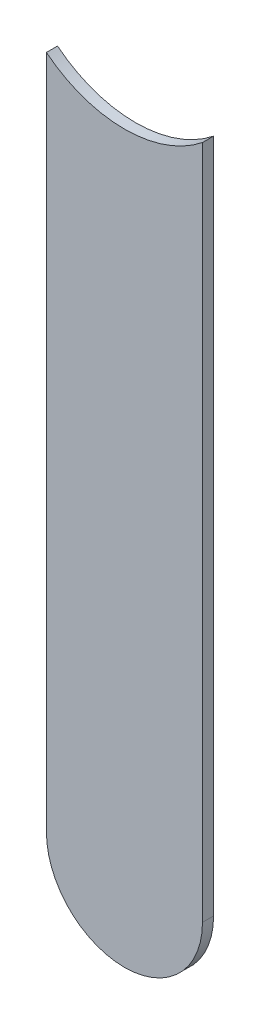
ISO-10303-21;
HEADER;
FILE_DESCRIPTION(('STEP AP214'),'2;1');
FILE_NAME('part.step','',(''),(''),'','','');
FILE_SCHEMA(('AUTOMOTIVE_DESIGN { 1 0 10303 214 1 1 1 1 }'));
ENDSEC;
DATA;
#1=APPLICATION_CONTEXT('core data for automotive mechanical design processes');
#2=APPLICATION_PROTOCOL_DEFINITION('international standard','automotive_design',2000,#1);
#3=PRODUCT_CONTEXT('',#1,'mechanical');
#4=PRODUCT('Part','Part','',(#3));
#5=PRODUCT_RELATED_PRODUCT_CATEGORY('part','',(#4));
#6=PRODUCT_DEFINITION_FORMATION('','',#4);
#7=PRODUCT_DEFINITION_CONTEXT('part definition',#1,'design');
#8=PRODUCT_DEFINITION('design','',#6,#7);
#9=PRODUCT_DEFINITION_SHAPE('','',#8);
#10=(LENGTH_UNIT() NAMED_UNIT(*) SI_UNIT(.MILLI.,.METRE.));
#11=(NAMED_UNIT(*) PLANE_ANGLE_UNIT() SI_UNIT($,.RADIAN.));
#12=(NAMED_UNIT(*) SI_UNIT($,.STERADIAN.) SOLID_ANGLE_UNIT());
#13=UNCERTAINTY_MEASURE_WITH_UNIT(LENGTH_MEASURE(1.E-05),#10,'distance_accuracy_value','');
#14=(GEOMETRIC_REPRESENTATION_CONTEXT(3) GLOBAL_UNCERTAINTY_ASSIGNED_CONTEXT((#13)) GLOBAL_UNIT_ASSIGNED_CONTEXT((#10,
#11,#12)) REPRESENTATION_CONTEXT('',''));
#15=CARTESIAN_POINT('',(0.,0.,0.));
#16=DIRECTION('',(0.,0.,1.));
#17=DIRECTION('',(1.,0.,0.));
#18=AXIS2_PLACEMENT_3D('',#15,#16,#17);
#19=CARTESIAN_POINT('',(60.2100015,60.1239844,0.));
#20=DIRECTION('',(-1.,0.,0.));
#21=DIRECTION('',(0.,1.,0.));
#22=AXIS2_PLACEMENT_3D('',#19,#20,#21);
#23=PLANE('',#22);
#24=DIRECTION('',(0.,1.,0.));
#25=VECTOR('',#24,1.);
#26=CARTESIAN_POINT('',(60.2100015,60.1239844,0.03556));
#27=LINE('',#26,#25);
#28=CARTESIAN_POINT('',(60.2100015,60.1239844,0.03556));
#29=VERTEX_POINT('',#28);
#30=CARTESIAN_POINT('',(60.2100015,62.2877779245799,0.03556));
#31=VERTEX_POINT('',#30);
#32=EDGE_CURVE('E11',#29,#31,#27,.T.);
#33=ORIENTED_EDGE('',*,*,#32,.F.);
#34=DIRECTION('',(0.,0.,1.));
#35=VECTOR('',#34,1.);
#36=CARTESIAN_POINT('',(60.2100015,60.1239844,0.));
#37=LINE('',#36,#35);
#38=CARTESIAN_POINT('',(60.2100015,60.1239844,0.));
#39=VERTEX_POINT('',#38);
#40=EDGE_CURVE('E24',#39,#29,#37,.T.);
#41=ORIENTED_EDGE('',*,*,#40,.F.);
#42=DIRECTION('',(0.,1.,0.));
#43=VECTOR('',#42,1.);
#44=CARTESIAN_POINT('',(60.2100015,60.1239844,0.));
#45=LINE('',#44,#43);
#46=CARTESIAN_POINT('',(60.2100015,62.2877779245799,0.));
#47=VERTEX_POINT('',#46);
#48=EDGE_CURVE('E75',#39,#47,#45,.T.);
#49=ORIENTED_EDGE('',*,*,#48,.T.);
#50=DIRECTION('',(0.,0.,1.));
#51=VECTOR('',#50,1.);
#52=CARTESIAN_POINT('',(60.2100015,62.2877779245799,0.));
#53=LINE('',#52,#51);
#54=EDGE_CURVE('E37',#47,#31,#53,.T.);
#55=ORIENTED_EDGE('',*,*,#54,.T.);
#56=EDGE_LOOP('',(#33,#41,#49,#55));
#57=FACE_BOUND('',#56,.T.);
#58=ADVANCED_FACE('F17',(#57),#23,.F.);
#59=CARTESIAN_POINT('',(59.960002,62.6000272,0.));
#60=DIRECTION('',(0.,0.,-1.));
#61=DIRECTION('',(1.,0.,0.));
#62=AXIS2_PLACEMENT_3D('',#59,#60,#61);
#63=CYLINDRICAL_SURFACE('',#62,0.3999992);
#64=DIRECTION('',(0.,0.,1.));
#65=VECTOR('',#64,1.);
#66=CARTESIAN_POINT('',(59.7100025,62.2877779245799,0.));
#67=LINE('',#66,#65);
#68=CARTESIAN_POINT('',(59.7100025,62.2877779245799,0.));
#69=VERTEX_POINT('',#68);
#70=CARTESIAN_POINT('',(59.7100025,62.2877779245799,0.03556));
#71=VERTEX_POINT('',#70);
#72=EDGE_CURVE('E67',#69,#71,#67,.T.);
#73=ORIENTED_EDGE('',*,*,#72,.T.);
#74=CARTESIAN_POINT('',(59.960002,62.6000272,0.03556));
#75=DIRECTION('',(0.,0.,1.));
#76=DIRECTION('',(1.,0.,0.));
#77=AXIS2_PLACEMENT_3D('',#74,#75,#76);
#78=CIRCLE('',#77,0.3999992);
#79=EDGE_CURVE('E82',#71,#31,#78,.T.);
#80=ORIENTED_EDGE('',*,*,#79,.T.);
#81=ORIENTED_EDGE('',*,*,#54,.F.);
#82=CARTESIAN_POINT('',(59.960002,62.6000272,0.));
#83=DIRECTION('',(0.,0.,1.));
#84=DIRECTION('',(1.,0.,0.));
#85=AXIS2_PLACEMENT_3D('',#82,#83,#84);
#86=CIRCLE('',#85,0.3999992);
#87=EDGE_CURVE('E80',#69,#47,#86,.T.);
#88=ORIENTED_EDGE('',*,*,#87,.F.);
#89=EDGE_LOOP('',(#73,#80,#81,#88));
#90=FACE_BOUND('',#89,.T.);
#91=ADVANCED_FACE('F88',(#90),#63,.F.);
#92=CARTESIAN_POINT('',(59.7100025,62.2877779245799,0.));
#93=DIRECTION('',(1.,0.,0.));
#94=DIRECTION('',(0.,-1.,0.));
#95=AXIS2_PLACEMENT_3D('',#92,#93,#94);
#96=PLANE('',#95);
#97=DIRECTION('',(0.,-1.,0.));
#98=VECTOR('',#97,1.);
#99=CARTESIAN_POINT('',(59.7100025,62.6000272,0.03556));
#100=LINE('',#99,#98);
#101=CARTESIAN_POINT('',(59.7100025,60.1239844,0.03556));
#102=VERTEX_POINT('',#101);
#103=EDGE_CURVE('E71',#71,#102,#100,.T.);
#104=ORIENTED_EDGE('',*,*,#103,.F.);
#105=ORIENTED_EDGE('',*,*,#72,.F.);
#106=DIRECTION('',(0.,-1.,0.));
#107=VECTOR('',#106,1.);
#108=CARTESIAN_POINT('',(59.7100025,62.6000272,0.));
#109=LINE('',#108,#107);
#110=CARTESIAN_POINT('',(59.7100025,60.1239844,0.));
#111=VERTEX_POINT('',#110);
#112=EDGE_CURVE('E63',#69,#111,#109,.T.);
#113=ORIENTED_EDGE('',*,*,#112,.T.);
#114=DIRECTION('',(0.,0.,1.));
#115=VECTOR('',#114,1.);
#116=CARTESIAN_POINT('',(59.7100025,60.1239844,0.));
#117=LINE('',#116,#115);
#118=EDGE_CURVE('E53',#111,#102,#117,.T.);
#119=ORIENTED_EDGE('',*,*,#118,.T.);
#120=EDGE_LOOP('',(#104,#105,#113,#119));
#121=FACE_BOUND('',#120,.T.);
#122=ADVANCED_FACE('F66',(#121),#96,.F.);
#123=CARTESIAN_POINT('',(59.960002,60.1239844,0.));
#124=DIRECTION('',(0.,0.,-1.));
#125=DIRECTION('',(-1.,0.,0.));
#126=AXIS2_PLACEMENT_3D('',#123,#124,#125);
#127=CYLINDRICAL_SURFACE('',#126,0.249999500000001);
#128=CARTESIAN_POINT('',(59.960002,60.1239844,0.03556));
#129=DIRECTION('',(0.,0.,1.));
#130=DIRECTION('',(-1.,0.,0.));
#131=AXIS2_PLACEMENT_3D('',#128,#129,#130);
#132=CIRCLE('',#131,0.249999500000001);
#133=EDGE_CURVE('E59',#102,#29,#132,.T.);
#134=ORIENTED_EDGE('',*,*,#133,.F.);
#135=ORIENTED_EDGE('',*,*,#118,.F.);
#136=CARTESIAN_POINT('',(59.960002,60.1239844,0.));
#137=DIRECTION('',(0.,0.,1.));
#138=DIRECTION('',(-1.,0.,0.));
#139=AXIS2_PLACEMENT_3D('',#136,#137,#138);
#140=CIRCLE('',#139,0.249999500000001);
#141=EDGE_CURVE('E57',#111,#39,#140,.T.);
#142=ORIENTED_EDGE('',*,*,#141,.T.);
#143=ORIENTED_EDGE('',*,*,#40,.T.);
#144=EDGE_LOOP('',(#134,#135,#142,#143));
#145=FACE_BOUND('',#144,.T.);
#146=ADVANCED_FACE('F55',(#145),#127,.T.);
#147=CARTESIAN_POINT('',(60.2100015,60.1239844,0.));
#148=DIRECTION('',(0.,0.,-1.));
#149=DIRECTION('',(-1.,0.,0.));
#150=AXIS2_PLACEMENT_3D('',#147,#148,#149);
#151=PLANE('',#150);
#152=ORIENTED_EDGE('',*,*,#48,.F.);
#153=ORIENTED_EDGE('',*,*,#141,.F.);
#154=ORIENTED_EDGE('',*,*,#112,.F.);
#155=ORIENTED_EDGE('',*,*,#87,.T.);
#156=EDGE_LOOP('',(#152,#153,#154,#155));
#157=FACE_BOUND('',#156,.T.);
#158=ADVANCED_FACE('F74',(#157),#151,.T.);
#159=CARTESIAN_POINT('',(60.2100015,60.1239844,0.03556));
#160=DIRECTION('',(0.,0.,-1.));
#161=DIRECTION('',(-1.,0.,0.));
#162=AXIS2_PLACEMENT_3D('',#159,#160,#161);
#163=PLANE('',#162);
#164=ORIENTED_EDGE('',*,*,#133,.T.);
#165=ORIENTED_EDGE('',*,*,#32,.T.);
#166=ORIENTED_EDGE('',*,*,#79,.F.);
#167=ORIENTED_EDGE('',*,*,#103,.T.);
#168=EDGE_LOOP('',(#164,#165,#166,#167));
#169=FACE_BOUND('',#168,.T.);
#170=ADVANCED_FACE('F91',(#169),#163,.F.);
#171=CLOSED_SHELL('',(#58,#91,#122,#146,#158,#170));
#172=MANIFOLD_SOLID_BREP('B1',#171);
#173=ADVANCED_BREP_SHAPE_REPRESENTATION('',(#18,#172),#14);
#174=SHAPE_DEFINITION_REPRESENTATION(#9,#173);
ENDSEC;
END-ISO-10303-21;
